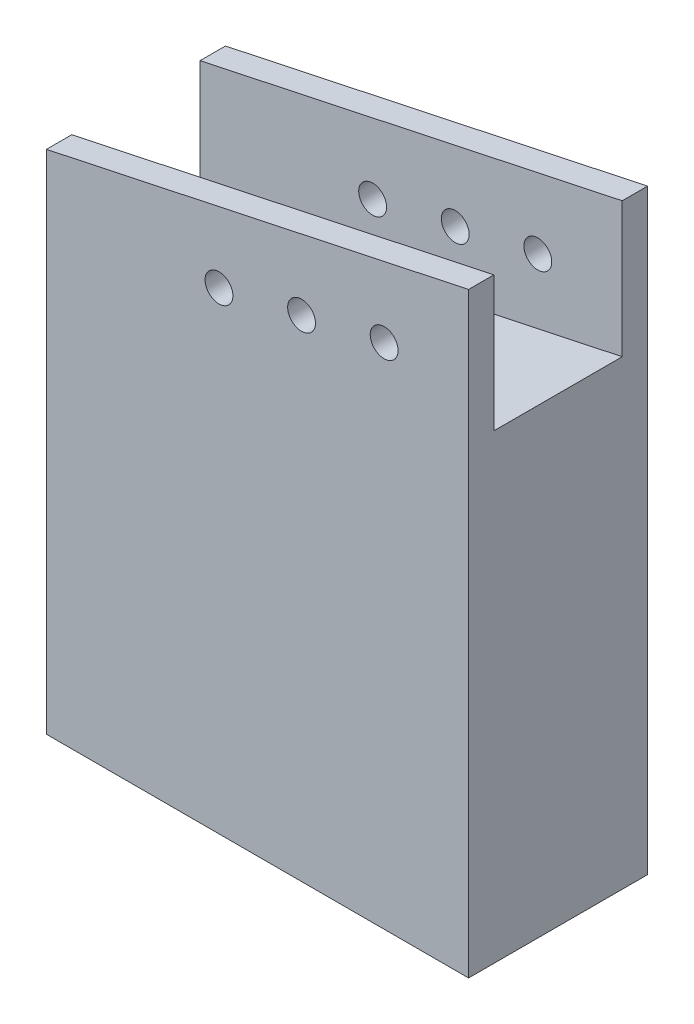
ISO-10303-21;
HEADER;
FILE_DESCRIPTION(('STEP AP214'),'2;1');
FILE_NAME('part.step','',(''),(''),'','','');
FILE_SCHEMA(('AUTOMOTIVE_DESIGN { 1 0 10303 214 1 1 1 1 }'));
ENDSEC;
DATA;
#1=APPLICATION_CONTEXT('core data for automotive mechanical design processes');
#2=APPLICATION_PROTOCOL_DEFINITION('international standard','automotive_design',2000,#1);
#3=PRODUCT_CONTEXT('',#1,'mechanical');
#4=PRODUCT('Part','Part','',(#3));
#5=PRODUCT_RELATED_PRODUCT_CATEGORY('part','',(#4));
#6=PRODUCT_DEFINITION_FORMATION('','',#4);
#7=PRODUCT_DEFINITION_CONTEXT('part definition',#1,'design');
#8=PRODUCT_DEFINITION('design','',#6,#7);
#9=PRODUCT_DEFINITION_SHAPE('','',#8);
#10=(LENGTH_UNIT() NAMED_UNIT(*) SI_UNIT(.MILLI.,.METRE.));
#11=(NAMED_UNIT(*) PLANE_ANGLE_UNIT() SI_UNIT($,.RADIAN.));
#12=(NAMED_UNIT(*) SI_UNIT($,.STERADIAN.) SOLID_ANGLE_UNIT());
#13=UNCERTAINTY_MEASURE_WITH_UNIT(LENGTH_MEASURE(1.E-05),#10,'distance_accuracy_value','');
#14=(GEOMETRIC_REPRESENTATION_CONTEXT(3) GLOBAL_UNCERTAINTY_ASSIGNED_CONTEXT((#13)) GLOBAL_UNIT_ASSIGNED_CONTEXT((#10,
#11,#12)) REPRESENTATION_CONTEXT('',''));
#15=CARTESIAN_POINT('',(0.,0.,0.));
#16=DIRECTION('',(0.,0.,1.));
#17=DIRECTION('',(1.,0.,0.));
#18=AXIS2_PLACEMENT_3D('',#15,#16,#17);
#19=CARTESIAN_POINT('',(25.,-30.,10.6));
#20=DIRECTION('',(-1.,0.,0.));
#21=DIRECTION('',(0.,0.,1.));
#22=AXIS2_PLACEMENT_3D('',#19,#20,#21);
#23=PLANE('',#22);
#24=DIRECTION('',(0.,0.,-1.));
#25=VECTOR('',#24,1.);
#26=CARTESIAN_POINT('',(25.,24.6278280835008,-7.6));
#27=LINE('',#26,#25);
#28=CARTESIAN_POINT('',(25.,24.6278280835008,7.6));
#29=VERTEX_POINT('',#28);
#30=CARTESIAN_POINT('',(25.,24.6278280835008,-7.6));
#31=VERTEX_POINT('',#30);
#32=EDGE_CURVE('E154',#29,#31,#27,.T.);
#33=ORIENTED_EDGE('',*,*,#32,.F.);
#34=DIRECTION('',(0.,1.,0.));
#35=VECTOR('',#34,1.);
#36=CARTESIAN_POINT('',(25.,30.,7.6));
#37=LINE('',#36,#35);
#38=CARTESIAN_POINT('',(25.,40.6278280835008,7.6));
#39=VERTEX_POINT('',#38);
#40=EDGE_CURVE('E116',#29,#39,#37,.T.);
#41=ORIENTED_EDGE('',*,*,#40,.T.);
#42=DIRECTION('',(0.,0.,1.));
#43=VECTOR('',#42,1.);
#44=CARTESIAN_POINT('',(25.,40.6278280835008,7.6));
#45=LINE('',#44,#43);
#46=CARTESIAN_POINT('',(25.,40.6278280835008,10.6));
#47=VERTEX_POINT('',#46);
#48=EDGE_CURVE('E114',#39,#47,#45,.T.);
#49=ORIENTED_EDGE('',*,*,#48,.T.);
#50=DIRECTION('',(0.,1.,0.));
#51=VECTOR('',#50,1.);
#52=CARTESIAN_POINT('',(25.,-30.,10.6));
#53=LINE('',#52,#51);
#54=CARTESIAN_POINT('',(25.,-30.,10.6));
#55=VERTEX_POINT('',#54);
#56=EDGE_CURVE('E92',#55,#47,#53,.T.);
#57=ORIENTED_EDGE('',*,*,#56,.F.);
#58=DIRECTION('',(0.,0.,-1.));
#59=VECTOR('',#58,1.);
#60=CARTESIAN_POINT('',(25.,-30.,10.6));
#61=LINE('',#60,#59);
#62=CARTESIAN_POINT('',(25.,-30.,-10.6));
#63=VERTEX_POINT('',#62);
#64=EDGE_CURVE('E86',#55,#63,#61,.T.);
#65=ORIENTED_EDGE('',*,*,#64,.T.);
#66=DIRECTION('',(0.,1.,0.));
#67=VECTOR('',#66,1.);
#68=CARTESIAN_POINT('',(25.,-30.,-10.6));
#69=LINE('',#68,#67);
#70=CARTESIAN_POINT('',(25.,40.6278280835008,-10.6));
#71=VERTEX_POINT('',#70);
#72=EDGE_CURVE('E103',#63,#71,#69,.T.);
#73=ORIENTED_EDGE('',*,*,#72,.T.);
#74=DIRECTION('',(0.,0.,1.));
#75=VECTOR('',#74,1.);
#76=CARTESIAN_POINT('',(25.,40.6278280835008,-10.6));
#77=LINE('',#76,#75);
#78=CARTESIAN_POINT('',(25.,40.6278280835008,-7.6));
#79=VERTEX_POINT('',#78);
#80=EDGE_CURVE('E134',#71,#79,#77,.T.);
#81=ORIENTED_EDGE('',*,*,#80,.T.);
#82=DIRECTION('',(0.,1.,0.));
#83=VECTOR('',#82,1.);
#84=CARTESIAN_POINT('',(25.,30.,-7.6));
#85=LINE('',#84,#83);
#86=EDGE_CURVE('E146',#31,#79,#85,.T.);
#87=ORIENTED_EDGE('',*,*,#86,.F.);
#88=EDGE_LOOP('',(#33,#41,#49,#57,#65,#73,#81,#87));
#89=FACE_BOUND('',#88,.T.);
#90=ADVANCED_FACE('F44',(#89),#23,.F.);
#91=CARTESIAN_POINT('',(-25.,-30.,10.6));
#92=DIRECTION('',(1.,0.,0.));
#93=DIRECTION('',(0.,0.,-1.));
#94=AXIS2_PLACEMENT_3D('',#91,#92,#93);
#95=PLANE('',#94);
#96=DIRECTION('',(0.,1.,0.));
#97=VECTOR('',#96,1.);
#98=CARTESIAN_POINT('',(-25.,24.8404350956593,7.6));
#99=LINE('',#98,#97);
#100=CARTESIAN_POINT('',(-25.,14.,7.6));
#101=VERTEX_POINT('',#100);
#102=CARTESIAN_POINT('',(-25.,30.,7.6));
#103=VERTEX_POINT('',#102);
#104=EDGE_CURVE('E164',#101,#103,#99,.T.);
#105=ORIENTED_EDGE('',*,*,#104,.F.);
#106=DIRECTION('',(0.,0.,1.));
#107=VECTOR('',#106,1.);
#108=CARTESIAN_POINT('',(-25.,14.,-7.6));
#109=LINE('',#108,#107);
#110=CARTESIAN_POINT('',(-25.,14.,-7.6));
#111=VERTEX_POINT('',#110);
#112=EDGE_CURVE('E161',#111,#101,#109,.T.);
#113=ORIENTED_EDGE('',*,*,#112,.F.);
#114=DIRECTION('',(0.,-1.,0.));
#115=VECTOR('',#114,1.);
#116=CARTESIAN_POINT('',(-25.,24.8404350956593,-7.6));
#117=LINE('',#116,#115);
#118=CARTESIAN_POINT('',(-25.,30.,-7.6));
#119=VERTEX_POINT('',#118);
#120=EDGE_CURVE('E58',#119,#111,#117,.T.);
#121=ORIENTED_EDGE('',*,*,#120,.F.);
#122=DIRECTION('',(0.,0.,1.));
#123=VECTOR('',#122,1.);
#124=CARTESIAN_POINT('',(-25.,30.,-10.6));
#125=LINE('',#124,#123);
#126=CARTESIAN_POINT('',(-25.,30.,-10.6));
#127=VERTEX_POINT('',#126);
#128=EDGE_CURVE('E142',#127,#119,#125,.T.);
#129=ORIENTED_EDGE('',*,*,#128,.F.);
#130=DIRECTION('',(0.,-1.,0.));
#131=VECTOR('',#130,1.);
#132=CARTESIAN_POINT('',(-25.,-30.,-10.6));
#133=LINE('',#132,#131);
#134=CARTESIAN_POINT('',(-25.,-30.,-10.6));
#135=VERTEX_POINT('',#134);
#136=EDGE_CURVE('E96',#127,#135,#133,.T.);
#137=ORIENTED_EDGE('',*,*,#136,.T.);
#138=DIRECTION('',(0.,0.,-1.));
#139=VECTOR('',#138,1.);
#140=CARTESIAN_POINT('',(-25.,-30.,10.6));
#141=LINE('',#140,#139);
#142=CARTESIAN_POINT('',(-25.,-30.,10.6));
#143=VERTEX_POINT('',#142);
#144=EDGE_CURVE('E52',#143,#135,#141,.T.);
#145=ORIENTED_EDGE('',*,*,#144,.F.);
#146=DIRECTION('',(0.,-1.,0.));
#147=VECTOR('',#146,1.);
#148=CARTESIAN_POINT('',(-25.,-30.,10.6));
#149=LINE('',#148,#147);
#150=CARTESIAN_POINT('',(-25.,30.,10.6));
#151=VERTEX_POINT('',#150);
#152=EDGE_CURVE('E123',#151,#143,#149,.T.);
#153=ORIENTED_EDGE('',*,*,#152,.F.);
#154=DIRECTION('',(0.,0.,-1.));
#155=VECTOR('',#154,1.);
#156=CARTESIAN_POINT('',(-25.,30.,10.6));
#157=LINE('',#156,#155);
#158=EDGE_CURVE('E11',#151,#103,#157,.T.);
#159=ORIENTED_EDGE('',*,*,#158,.T.);
#160=EDGE_LOOP('',(#105,#113,#121,#129,#137,#145,#153,#159));
#161=FACE_BOUND('',#160,.T.);
#162=ADVANCED_FACE('F283',(#161),#95,.F.);
#163=CARTESIAN_POINT('',(-25.,-30.,10.6));
#164=DIRECTION('',(0.,1.,0.));
#165=DIRECTION('',(0.,0.,1.));
#166=AXIS2_PLACEMENT_3D('',#163,#164,#165);
#167=PLANE('',#166);
#168=DIRECTION('',(1.,0.,0.));
#169=VECTOR('',#168,1.);
#170=CARTESIAN_POINT('',(-25.,-30.,-10.6));
#171=LINE('',#170,#169);
#172=EDGE_CURVE('E83',#135,#63,#171,.T.);
#173=ORIENTED_EDGE('',*,*,#172,.T.);
#174=ORIENTED_EDGE('',*,*,#64,.F.);
#175=DIRECTION('',(1.,0.,0.));
#176=VECTOR('',#175,1.);
#177=CARTESIAN_POINT('',(-25.,-30.,10.6));
#178=LINE('',#177,#176);
#179=EDGE_CURVE('E66',#143,#55,#178,.T.);
#180=ORIENTED_EDGE('',*,*,#179,.F.);
#181=ORIENTED_EDGE('',*,*,#144,.T.);
#182=EDGE_LOOP('',(#173,#174,#180,#181));
#183=FACE_BOUND('',#182,.T.);
#184=ADVANCED_FACE('F87',(#183),#167,.F.);
#185=CARTESIAN_POINT('',(0.,0.,10.6));
#186=DIRECTION('',(0.,0.,-1.));
#187=DIRECTION('',(-1.,0.,0.));
#188=AXIS2_PLACEMENT_3D('',#185,#186,#187);
#189=PLANE('',#188);
#190=CARTESIAN_POINT('',(-4.56295201467614,26.0115831119333,10.6));
#191=DIRECTION('',(0.,0.,1.));
#192=DIRECTION('',(1.,0.,0.));
#193=AXIS2_PLACEMENT_3D('',#190,#191,#192);
#194=CIRCLE('',#193,1.65);
#195=CARTESIAN_POINT('',(-2.91295201467614,26.0115831119333,10.6));
#196=VERTEX_POINT('',#195);
#197=EDGE_CURVE('E184',#196,#196,#194,.T.);
#198=ORIENTED_EDGE('',*,*,#197,.F.);
#199=EDGE_LOOP('',(#198));
#200=FACE_BOUND('',#199,.T.);
#201=CARTESIAN_POINT('',(5.21852399266192,28.0907000201108,10.6));
#202=DIRECTION('',(0.,0.,1.));
#203=DIRECTION('',(1.,0.,0.));
#204=AXIS2_PLACEMENT_3D('',#201,#202,#203);
#205=CIRCLE('',#204,1.65);
#206=CARTESIAN_POINT('',(6.86852399266192,28.0907000201108,10.6));
#207=VERTEX_POINT('',#206);
#208=EDGE_CURVE('E214',#207,#207,#205,.T.);
#209=ORIENTED_EDGE('',*,*,#208,.F.);
#210=EDGE_LOOP('',(#209));
#211=FACE_BOUND('',#210,.T.);
#212=CARTESIAN_POINT('',(15.,30.1698169282883,10.6));
#213=DIRECTION('',(0.,0.,1.));
#214=DIRECTION('',(1.,0.,0.));
#215=AXIS2_PLACEMENT_3D('',#212,#213,#214);
#216=CIRCLE('',#215,1.65);
#217=CARTESIAN_POINT('',(16.65,30.1698169282883,10.6));
#218=VERTEX_POINT('',#217);
#219=EDGE_CURVE('E210',#218,#218,#216,.T.);
#220=ORIENTED_EDGE('',*,*,#219,.F.);
#221=EDGE_LOOP('',(#220));
#222=FACE_BOUND('',#221,.T.);
#223=ORIENTED_EDGE('',*,*,#56,.T.);
#224=DIRECTION('',(-0.978147600733807,-0.207911690817753,0.));
#225=VECTOR('',#224,1.);
#226=CARTESIAN_POINT('',(25.,40.6278280835008,10.6));
#227=LINE('',#226,#225);
#228=EDGE_CURVE('E133',#47,#151,#227,.T.);
#229=ORIENTED_EDGE('',*,*,#228,.T.);
#230=ORIENTED_EDGE('',*,*,#152,.T.);
#231=ORIENTED_EDGE('',*,*,#179,.T.);
#232=EDGE_LOOP('',(#223,#229,#230,#231));
#233=FACE_BOUND('',#232,.T.);
#234=ADVANCED_FACE('F229',(#200,#211,#222,#233),#189,.F.);
#235=CARTESIAN_POINT('',(0.,0.,-10.6));
#236=DIRECTION('',(0.,0.,-1.));
#237=DIRECTION('',(-1.,0.,0.));
#238=AXIS2_PLACEMENT_3D('',#235,#236,#237);
#239=PLANE('',#238);
#240=CARTESIAN_POINT('',(-4.56295201467614,26.0115831119333,-10.6));
#241=DIRECTION('',(0.,0.,1.));
#242=DIRECTION('',(1.,0.,0.));
#243=AXIS2_PLACEMENT_3D('',#240,#241,#242);
#244=CIRCLE('',#243,1.65);
#245=CARTESIAN_POINT('',(-2.91295201467614,26.0115831119333,-10.6));
#246=VERTEX_POINT('',#245);
#247=EDGE_CURVE('E171',#246,#246,#244,.T.);
#248=ORIENTED_EDGE('',*,*,#247,.T.);
#249=EDGE_LOOP('',(#248));
#250=FACE_BOUND('',#249,.T.);
#251=CARTESIAN_POINT('',(5.21852399266192,28.0907000201108,-10.6));
#252=DIRECTION('',(0.,0.,1.));
#253=DIRECTION('',(1.,0.,0.));
#254=AXIS2_PLACEMENT_3D('',#251,#252,#253);
#255=CIRCLE('',#254,1.65);
#256=CARTESIAN_POINT('',(6.86852399266192,28.0907000201108,-10.6));
#257=VERTEX_POINT('',#256);
#258=EDGE_CURVE('E186',#257,#257,#255,.T.);
#259=ORIENTED_EDGE('',*,*,#258,.T.);
#260=EDGE_LOOP('',(#259));
#261=FACE_BOUND('',#260,.T.);
#262=CARTESIAN_POINT('',(15.,30.1698169282883,-10.6));
#263=DIRECTION('',(0.,0.,1.));
#264=DIRECTION('',(1.,0.,0.));
#265=AXIS2_PLACEMENT_3D('',#262,#263,#264);
#266=CIRCLE('',#265,1.65);
#267=CARTESIAN_POINT('',(16.65,30.1698169282883,-10.6));
#268=VERTEX_POINT('',#267);
#269=EDGE_CURVE('E176',#268,#268,#266,.T.);
#270=ORIENTED_EDGE('',*,*,#269,.T.);
#271=EDGE_LOOP('',(#270));
#272=FACE_BOUND('',#271,.T.);
#273=ORIENTED_EDGE('',*,*,#72,.F.);
#274=ORIENTED_EDGE('',*,*,#172,.F.);
#275=ORIENTED_EDGE('',*,*,#136,.F.);
#276=DIRECTION('',(-0.978147600733807,-0.207911690817753,0.));
#277=VECTOR('',#276,1.);
#278=CARTESIAN_POINT('',(25.,40.6278280835008,-10.6));
#279=LINE('',#278,#277);
#280=EDGE_CURVE('E112',#71,#127,#279,.T.);
#281=ORIENTED_EDGE('',*,*,#280,.F.);
#282=EDGE_LOOP('',(#273,#274,#275,#281));
#283=FACE_BOUND('',#282,.T.);
#284=ADVANCED_FACE('F108',(#250,#261,#272,#283),#239,.T.);
#285=CARTESIAN_POINT('',(25.,40.6278280835008,7.6));
#286=DIRECTION('',(-0.207911690817753,0.978147600733807,0.));
#287=DIRECTION('',(-0.978147600733807,-0.207911690817753,0.));
#288=AXIS2_PLACEMENT_3D('',#285,#286,#287);
#289=PLANE('',#288);
#290=ORIENTED_EDGE('',*,*,#228,.F.);
#291=ORIENTED_EDGE('',*,*,#48,.F.);
#292=DIRECTION('',(-0.978147600733807,-0.207911690817753,0.));
#293=VECTOR('',#292,1.);
#294=CARTESIAN_POINT('',(25.,40.6278280835008,7.6));
#295=LINE('',#294,#293);
#296=EDGE_CURVE('E132',#39,#103,#295,.T.);
#297=ORIENTED_EDGE('',*,*,#296,.T.);
#298=ORIENTED_EDGE('',*,*,#158,.F.);
#299=EDGE_LOOP('',(#290,#291,#297,#298));
#300=FACE_BOUND('',#299,.T.);
#301=ADVANCED_FACE('F248',(#300),#289,.T.);
#302=CARTESIAN_POINT('',(0.,0.,7.6));
#303=DIRECTION('',(0.,0.,-1.));
#304=DIRECTION('',(-1.,0.,0.));
#305=AXIS2_PLACEMENT_3D('',#302,#303,#304);
#306=PLANE('',#305);
#307=CARTESIAN_POINT('',(-4.56295201467614,26.0115831119333,7.6));
#308=DIRECTION('',(0.,0.,1.));
#309=DIRECTION('',(1.,0.,0.));
#310=AXIS2_PLACEMENT_3D('',#307,#308,#309);
#311=CIRCLE('',#310,1.65);
#312=CARTESIAN_POINT('',(-2.91295201467614,26.0115831119333,7.6));
#313=VERTEX_POINT('',#312);
#314=EDGE_CURVE('E218',#313,#313,#311,.T.);
#315=ORIENTED_EDGE('',*,*,#314,.T.);
#316=EDGE_LOOP('',(#315));
#317=FACE_BOUND('',#316,.T.);
#318=CARTESIAN_POINT('',(5.21852399266192,28.0907000201108,7.6));
#319=DIRECTION('',(0.,0.,1.));
#320=DIRECTION('',(1.,0.,0.));
#321=AXIS2_PLACEMENT_3D('',#318,#319,#320);
#322=CIRCLE('',#321,1.65);
#323=CARTESIAN_POINT('',(6.86852399266192,28.0907000201108,7.6));
#324=VERTEX_POINT('',#323);
#325=EDGE_CURVE('E211',#324,#324,#322,.T.);
#326=ORIENTED_EDGE('',*,*,#325,.T.);
#327=EDGE_LOOP('',(#326));
#328=FACE_BOUND('',#327,.T.);
#329=CARTESIAN_POINT('',(15.,30.1698169282883,7.6));
#330=DIRECTION('',(0.,0.,1.));
#331=DIRECTION('',(1.,0.,0.));
#332=AXIS2_PLACEMENT_3D('',#329,#330,#331);
#333=CIRCLE('',#332,1.65);
#334=CARTESIAN_POINT('',(16.65,30.1698169282883,7.6));
#335=VERTEX_POINT('',#334);
#336=EDGE_CURVE('E201',#335,#335,#333,.T.);
#337=ORIENTED_EDGE('',*,*,#336,.T.);
#338=EDGE_LOOP('',(#337));
#339=FACE_BOUND('',#338,.T.);
#340=ORIENTED_EDGE('',*,*,#296,.F.);
#341=ORIENTED_EDGE('',*,*,#40,.F.);
#342=DIRECTION('',(-0.978147600733807,-0.207911690817753,0.));
#343=VECTOR('',#342,1.);
#344=CARTESIAN_POINT('',(26.0002373508875,24.8404350956593,7.6));
#345=LINE('',#344,#343);
#346=EDGE_CURVE('E166',#29,#101,#345,.T.);
#347=ORIENTED_EDGE('',*,*,#346,.T.);
#348=ORIENTED_EDGE('',*,*,#104,.T.);
#349=EDGE_LOOP('',(#340,#341,#347,#348));
#350=FACE_BOUND('',#349,.T.);
#351=ADVANCED_FACE('F247',(#317,#328,#339,#350),#306,.T.);
#352=CARTESIAN_POINT('',(25.,40.6278280835008,-10.6));
#353=DIRECTION('',(-0.207911690817753,0.978147600733807,0.));
#354=DIRECTION('',(-0.978147600733807,-0.207911690817753,0.));
#355=AXIS2_PLACEMENT_3D('',#352,#353,#354);
#356=PLANE('',#355);
#357=DIRECTION('',(-0.978147600733807,-0.207911690817753,0.));
#358=VECTOR('',#357,1.);
#359=CARTESIAN_POINT('',(25.,40.6278280835008,-7.6));
#360=LINE('',#359,#358);
#361=EDGE_CURVE('E155',#79,#119,#360,.T.);
#362=ORIENTED_EDGE('',*,*,#361,.F.);
#363=ORIENTED_EDGE('',*,*,#80,.F.);
#364=ORIENTED_EDGE('',*,*,#280,.T.);
#365=ORIENTED_EDGE('',*,*,#128,.T.);
#366=EDGE_LOOP('',(#362,#363,#364,#365));
#367=FACE_BOUND('',#366,.T.);
#368=ADVANCED_FACE('F246',(#367),#356,.T.);
#369=CARTESIAN_POINT('',(0.,0.,-7.6));
#370=DIRECTION('',(0.,0.,-1.));
#371=DIRECTION('',(-1.,0.,0.));
#372=AXIS2_PLACEMENT_3D('',#369,#370,#371);
#373=PLANE('',#372);
#374=CARTESIAN_POINT('',(-4.56295201467614,26.0115831119333,-7.6));
#375=DIRECTION('',(0.,0.,1.));
#376=DIRECTION('',(1.,0.,0.));
#377=AXIS2_PLACEMENT_3D('',#374,#375,#376);
#378=CIRCLE('',#377,1.65);
#379=CARTESIAN_POINT('',(-2.91295201467614,26.0115831119333,-7.6));
#380=VERTEX_POINT('',#379);
#381=EDGE_CURVE('E198',#380,#380,#378,.T.);
#382=ORIENTED_EDGE('',*,*,#381,.F.);
#383=EDGE_LOOP('',(#382));
#384=FACE_BOUND('',#383,.T.);
#385=CARTESIAN_POINT('',(5.21852399266192,28.0907000201108,-7.6));
#386=DIRECTION('',(0.,0.,1.));
#387=DIRECTION('',(1.,0.,0.));
#388=AXIS2_PLACEMENT_3D('',#385,#386,#387);
#389=CIRCLE('',#388,1.65);
#390=CARTESIAN_POINT('',(6.86852399266192,28.0907000201108,-7.6));
#391=VERTEX_POINT('',#390);
#392=EDGE_CURVE('E194',#391,#391,#389,.T.);
#393=ORIENTED_EDGE('',*,*,#392,.F.);
#394=EDGE_LOOP('',(#393));
#395=FACE_BOUND('',#394,.T.);
#396=CARTESIAN_POINT('',(15.,30.1698169282883,-7.6));
#397=DIRECTION('',(0.,0.,1.));
#398=DIRECTION('',(1.,0.,0.));
#399=AXIS2_PLACEMENT_3D('',#396,#397,#398);
#400=CIRCLE('',#399,1.65);
#401=CARTESIAN_POINT('',(16.65,30.1698169282883,-7.6));
#402=VERTEX_POINT('',#401);
#403=EDGE_CURVE('E181',#402,#402,#400,.T.);
#404=ORIENTED_EDGE('',*,*,#403,.F.);
#405=EDGE_LOOP('',(#404));
#406=FACE_BOUND('',#405,.T.);
#407=ORIENTED_EDGE('',*,*,#361,.T.);
#408=ORIENTED_EDGE('',*,*,#120,.T.);
#409=DIRECTION('',(-0.978147600733807,-0.207911690817753,0.));
#410=VECTOR('',#409,1.);
#411=CARTESIAN_POINT('',(26.0002373508875,24.8404350956593,-7.6));
#412=LINE('',#411,#410);
#413=EDGE_CURVE('E167',#31,#111,#412,.T.);
#414=ORIENTED_EDGE('',*,*,#413,.F.);
#415=ORIENTED_EDGE('',*,*,#86,.T.);
#416=EDGE_LOOP('',(#407,#408,#414,#415));
#417=FACE_BOUND('',#416,.T.);
#418=ADVANCED_FACE('F272',(#384,#395,#406,#417),#373,.F.);
#419=CARTESIAN_POINT('',(26.0002373508875,24.8404350956593,-7.6));
#420=DIRECTION('',(0.207911690817753,-0.978147600733807,0.));
#421=DIRECTION('',(0.978147600733807,0.207911690817753,0.));
#422=AXIS2_PLACEMENT_3D('',#419,#420,#421);
#423=PLANE('',#422);
#424=ORIENTED_EDGE('',*,*,#32,.T.);
#425=ORIENTED_EDGE('',*,*,#413,.T.);
#426=ORIENTED_EDGE('',*,*,#112,.T.);
#427=ORIENTED_EDGE('',*,*,#346,.F.);
#428=EDGE_LOOP('',(#424,#425,#426,#427));
#429=FACE_BOUND('',#428,.T.);
#430=ADVANCED_FACE('F267',(#429),#423,.F.);
#431=CARTESIAN_POINT('',(15.,30.1698169282883,-10.6));
#432=DIRECTION('',(0.,0.,1.));
#433=DIRECTION('',(1.,0.,0.));
#434=AXIS2_PLACEMENT_3D('',#431,#432,#433);
#435=CYLINDRICAL_SURFACE('',#434,1.65);
#436=ORIENTED_EDGE('',*,*,#269,.F.);
#437=EDGE_LOOP('',(#436));
#438=FACE_BOUND('',#437,.T.);
#439=ORIENTED_EDGE('',*,*,#403,.T.);
#440=EDGE_LOOP('',(#439));
#441=FACE_BOUND('',#440,.T.);
#442=ADVANCED_FACE('F365',(#438,#441),#435,.F.);
#443=CARTESIAN_POINT('',(5.21852399266192,28.0907000201108,-10.6));
#444=DIRECTION('',(0.,0.,1.));
#445=DIRECTION('',(1.,0.,0.));
#446=AXIS2_PLACEMENT_3D('',#443,#444,#445);
#447=CYLINDRICAL_SURFACE('',#446,1.65);
#448=ORIENTED_EDGE('',*,*,#258,.F.);
#449=EDGE_LOOP('',(#448));
#450=FACE_BOUND('',#449,.T.);
#451=ORIENTED_EDGE('',*,*,#392,.T.);
#452=EDGE_LOOP('',(#451));
#453=FACE_BOUND('',#452,.T.);
#454=ADVANCED_FACE('F375',(#450,#453),#447,.F.);
#455=CARTESIAN_POINT('',(-4.56295201467614,26.0115831119333,-10.6));
#456=DIRECTION('',(0.,0.,1.));
#457=DIRECTION('',(1.,0.,0.));
#458=AXIS2_PLACEMENT_3D('',#455,#456,#457);
#459=CYLINDRICAL_SURFACE('',#458,1.65);
#460=ORIENTED_EDGE('',*,*,#247,.F.);
#461=EDGE_LOOP('',(#460));
#462=FACE_BOUND('',#461,.T.);
#463=ORIENTED_EDGE('',*,*,#381,.T.);
#464=EDGE_LOOP('',(#463));
#465=FACE_BOUND('',#464,.T.);
#466=ADVANCED_FACE('F245',(#462,#465),#459,.F.);
#467=CARTESIAN_POINT('',(15.,30.1698169282883,10.6));
#468=DIRECTION('',(0.,0.,-1.));
#469=DIRECTION('',(-1.,0.,0.));
#470=AXIS2_PLACEMENT_3D('',#467,#468,#469);
#471=CYLINDRICAL_SURFACE('',#470,1.65);
#472=ORIENTED_EDGE('',*,*,#219,.T.);
#473=EDGE_LOOP('',(#472));
#474=FACE_BOUND('',#473,.T.);
#475=ORIENTED_EDGE('',*,*,#336,.F.);
#476=EDGE_LOOP('',(#475));
#477=FACE_BOUND('',#476,.T.);
#478=ADVANCED_FACE('F236',(#474,#477),#471,.F.);
#479=CARTESIAN_POINT('',(5.21852399266192,28.0907000201108,10.6));
#480=DIRECTION('',(0.,0.,-1.));
#481=DIRECTION('',(-1.,0.,0.));
#482=AXIS2_PLACEMENT_3D('',#479,#480,#481);
#483=CYLINDRICAL_SURFACE('',#482,1.65);
#484=ORIENTED_EDGE('',*,*,#208,.T.);
#485=EDGE_LOOP('',(#484));
#486=FACE_BOUND('',#485,.T.);
#487=ORIENTED_EDGE('',*,*,#325,.F.);
#488=EDGE_LOOP('',(#487));
#489=FACE_BOUND('',#488,.T.);
#490=ADVANCED_FACE('F243',(#486,#489),#483,.F.);
#491=CARTESIAN_POINT('',(-4.56295201467614,26.0115831119333,10.6));
#492=DIRECTION('',(0.,0.,-1.));
#493=DIRECTION('',(-1.,0.,0.));
#494=AXIS2_PLACEMENT_3D('',#491,#492,#493);
#495=CYLINDRICAL_SURFACE('',#494,1.65);
#496=ORIENTED_EDGE('',*,*,#197,.T.);
#497=EDGE_LOOP('',(#496));
#498=FACE_BOUND('',#497,.T.);
#499=ORIENTED_EDGE('',*,*,#314,.F.);
#500=EDGE_LOOP('',(#499));
#501=FACE_BOUND('',#500,.T.);
#502=ADVANCED_FACE('F230',(#498,#501),#495,.F.);
#503=CLOSED_SHELL('',(#90,#162,#184,#234,#284,#301,#351,#368,#418,#430,#442,#454,#466,#478,#490,#502));
#504=MANIFOLD_SOLID_BREP('B2',#503);
#505=ADVANCED_BREP_SHAPE_REPRESENTATION('',(#18,#504),#14);
#506=SHAPE_DEFINITION_REPRESENTATION(#9,#505);
ENDSEC;
END-ISO-10303-21;
